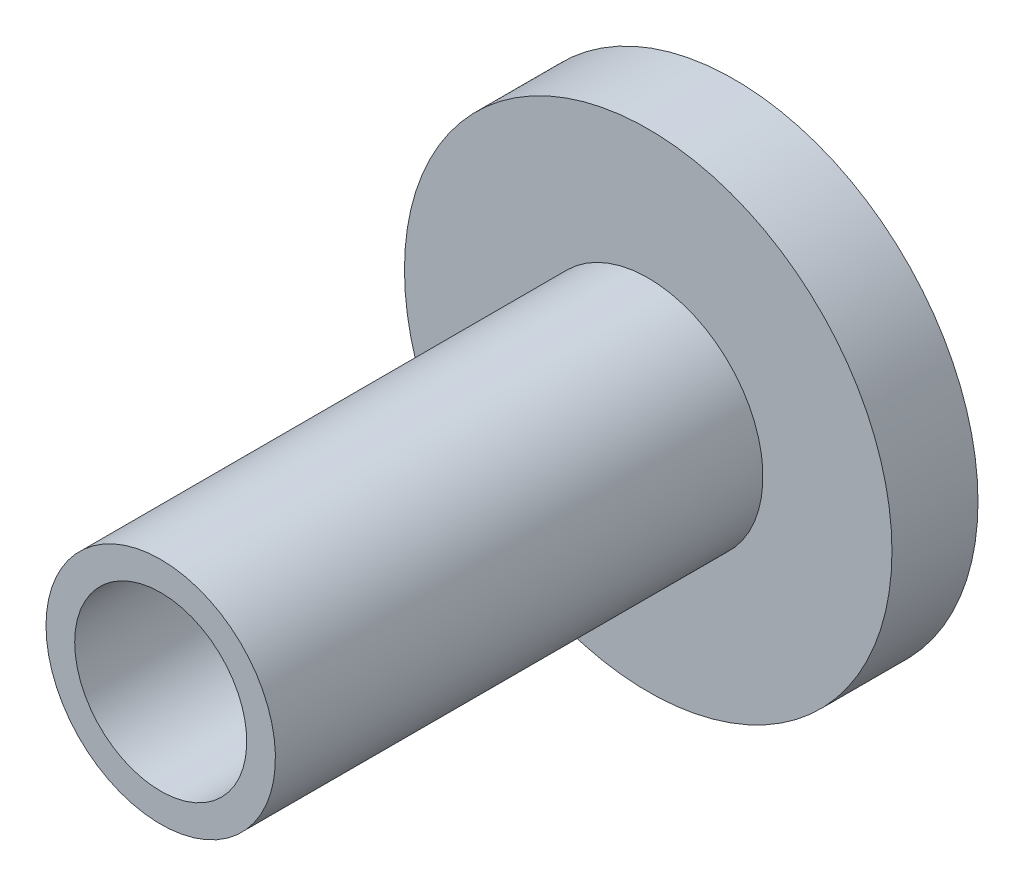
ISO-10303-21;
HEADER;
FILE_DESCRIPTION(('STEP AP214'),'2;1');
FILE_NAME('part.step','',(''),(''),'','','');
FILE_SCHEMA(('AUTOMOTIVE_DESIGN { 1 0 10303 214 1 1 1 1 }'));
ENDSEC;
DATA;
#1=APPLICATION_CONTEXT('core data for automotive mechanical design processes');
#2=APPLICATION_PROTOCOL_DEFINITION('international standard','automotive_design',2000,#1);
#3=PRODUCT_CONTEXT('',#1,'mechanical');
#4=PRODUCT('Part','Part','',(#3));
#5=PRODUCT_RELATED_PRODUCT_CATEGORY('part','',(#4));
#6=PRODUCT_DEFINITION_FORMATION('','',#4);
#7=PRODUCT_DEFINITION_CONTEXT('part definition',#1,'design');
#8=PRODUCT_DEFINITION('design','',#6,#7);
#9=PRODUCT_DEFINITION_SHAPE('','',#8);
#10=(LENGTH_UNIT() NAMED_UNIT(*) SI_UNIT(.MILLI.,.METRE.));
#11=(NAMED_UNIT(*) PLANE_ANGLE_UNIT() SI_UNIT($,.RADIAN.));
#12=(NAMED_UNIT(*) SI_UNIT($,.STERADIAN.) SOLID_ANGLE_UNIT());
#13=UNCERTAINTY_MEASURE_WITH_UNIT(LENGTH_MEASURE(1.E-05),#10,'distance_accuracy_value','');
#14=(GEOMETRIC_REPRESENTATION_CONTEXT(3) GLOBAL_UNCERTAINTY_ASSIGNED_CONTEXT((#13)) GLOBAL_UNIT_ASSIGNED_CONTEXT((#10,
#11,#12)) REPRESENTATION_CONTEXT('',''));
#15=CARTESIAN_POINT('',(0.,0.,0.));
#16=DIRECTION('',(0.,0.,1.));
#17=DIRECTION('',(1.,0.,0.));
#18=AXIS2_PLACEMENT_3D('',#15,#16,#17);
#19=CARTESIAN_POINT('',(131.385564386284,104.456236842962,103.210489149573));
#20=DIRECTION('',(0.,0.,-1.));
#21=DIRECTION('',(-1.,0.,0.));
#22=AXIS2_PLACEMENT_3D('',#19,#20,#21);
#23=PLANE('',#22);
#24=DIRECTION('',(-0.866025403784439,-0.5,0.));
#25=VECTOR('',#24,1.);
#26=CARTESIAN_POINT('',(131.385564386284,103.012861169988,103.210489149573));
#27=LINE('',#26,#25);
#28=CARTESIAN_POINT('',(132.635564386284,103.734549006475,103.210489149573));
#29=VERTEX_POINT('',#28);
#30=CARTESIAN_POINT('',(131.385564386284,103.012861169988,103.210489149573));
#31=VERTEX_POINT('',#30);
#32=EDGE_CURVE('E52',#29,#31,#27,.T.);
#33=ORIENTED_EDGE('',*,*,#32,.T.);
#34=DIRECTION('',(-0.866025403784438,0.5,0.));
#35=VECTOR('',#34,1.);
#36=CARTESIAN_POINT('',(130.135564386284,103.734549006475,103.210489149573));
#37=LINE('',#36,#35);
#38=CARTESIAN_POINT('',(130.135564386284,103.734549006475,103.210489149573));
#39=VERTEX_POINT('',#38);
#40=EDGE_CURVE('E11',#31,#39,#37,.T.);
#41=ORIENTED_EDGE('',*,*,#40,.T.);
#42=DIRECTION('',(0.,-1.,0.));
#43=VECTOR('',#42,1.);
#44=CARTESIAN_POINT('',(130.135564386284,105.17792467945,103.210489149573));
#45=LINE('',#44,#43);
#46=CARTESIAN_POINT('',(130.135564386284,105.17792467945,103.210489149573));
#47=VERTEX_POINT('',#46);
#48=EDGE_CURVE('E149',#47,#39,#45,.T.);
#49=ORIENTED_EDGE('',*,*,#48,.F.);
#50=DIRECTION('',(0.866025403784439,0.5,0.));
#51=VECTOR('',#50,1.);
#52=CARTESIAN_POINT('',(131.385564386284,105.899612515937,103.210489149573));
#53=LINE('',#52,#51);
#54=CARTESIAN_POINT('',(131.385564386284,105.899612515937,103.210489149573));
#55=VERTEX_POINT('',#54);
#56=EDGE_CURVE('E136',#47,#55,#53,.T.);
#57=ORIENTED_EDGE('',*,*,#56,.T.);
#58=DIRECTION('',(-0.866025403784439,0.5,0.));
#59=VECTOR('',#58,1.);
#60=CARTESIAN_POINT('',(132.635564386284,105.17792467945,103.210489149573));
#61=LINE('',#60,#59);
#62=CARTESIAN_POINT('',(132.635564386284,105.177924679449,103.210489149573));
#63=VERTEX_POINT('',#62);
#64=EDGE_CURVE('E201',#63,#55,#61,.T.);
#65=ORIENTED_EDGE('',*,*,#64,.F.);
#66=DIRECTION('',(0.,-1.,0.));
#67=VECTOR('',#66,1.);
#68=CARTESIAN_POINT('',(132.635564386284,103.734549006475,103.210489149573));
#69=LINE('',#68,#67);
#70=EDGE_CURVE('E169',#63,#29,#69,.T.);
#71=ORIENTED_EDGE('',*,*,#70,.T.);
#72=EDGE_LOOP('',(#33,#41,#49,#57,#65,#71));
#73=FACE_BOUND('',#72,.T.);
#74=ADVANCED_FACE('F42',(#73),#23,.T.);
#75=CARTESIAN_POINT('',(130.135564386284,103.734549006475,117.410489149573));
#76=DIRECTION('',(0.5,0.866025403784438,0.));
#77=DIRECTION('',(0.,0.,-1.));
#78=AXIS2_PLACEMENT_3D('',#75,#76,#77);
#79=PLANE('',#78);
#80=DIRECTION('',(0.,0.,1.));
#81=VECTOR('',#80,1.);
#82=CARTESIAN_POINT('',(130.135564386284,103.734549006475,117.410489149573));
#83=LINE('',#82,#81);
#84=CARTESIAN_POINT('',(130.135564386284,103.734549006475,102.210489149573));
#85=VERTEX_POINT('',#84);
#86=EDGE_CURVE('E152',#85,#39,#83,.T.);
#87=ORIENTED_EDGE('',*,*,#86,.T.);
#88=ORIENTED_EDGE('',*,*,#40,.F.);
#89=DIRECTION('',(0.,0.,1.));
#90=VECTOR('',#89,1.);
#91=CARTESIAN_POINT('',(131.385564386284,103.012861169988,117.410489149573));
#92=LINE('',#91,#90);
#93=CARTESIAN_POINT('',(131.385564386284,103.012861169988,102.210489149573));
#94=VERTEX_POINT('',#93);
#95=EDGE_CURVE('E179',#94,#31,#92,.T.);
#96=ORIENTED_EDGE('',*,*,#95,.F.);
#97=DIRECTION('',(0.866025403784438,-0.5,0.));
#98=VECTOR('',#97,1.);
#99=CARTESIAN_POINT('',(130.760564386284,103.373705088232,102.210489149573));
#100=LINE('',#99,#98);
#101=EDGE_CURVE('E216',#85,#94,#100,.T.);
#102=ORIENTED_EDGE('',*,*,#101,.F.);
#103=EDGE_LOOP('',(#87,#88,#96,#102));
#104=FACE_BOUND('',#103,.T.);
#105=ADVANCED_FACE('F239',(#104),#79,.T.);
#106=CARTESIAN_POINT('',(131.385564386284,103.012861169988,117.410489149573));
#107=DIRECTION('',(-0.5,0.866025403784439,0.));
#108=DIRECTION('',(0.,0.,1.));
#109=AXIS2_PLACEMENT_3D('',#106,#107,#108);
#110=PLANE('',#109);
#111=ORIENTED_EDGE('',*,*,#95,.T.);
#112=ORIENTED_EDGE('',*,*,#32,.F.);
#113=DIRECTION('',(0.,0.,1.));
#114=VECTOR('',#113,1.);
#115=CARTESIAN_POINT('',(132.635564386284,103.734549006475,117.410489149573));
#116=LINE('',#115,#114);
#117=CARTESIAN_POINT('',(132.635564386284,103.734549006475,102.210489149573));
#118=VERTEX_POINT('',#117);
#119=EDGE_CURVE('E188',#118,#29,#116,.T.);
#120=ORIENTED_EDGE('',*,*,#119,.F.);
#121=DIRECTION('',(0.866025403784439,0.5,0.));
#122=VECTOR('',#121,1.);
#123=CARTESIAN_POINT('',(132.010564386284,103.373705088232,102.210489149573));
#124=LINE('',#123,#122);
#125=EDGE_CURVE('E210',#94,#118,#124,.T.);
#126=ORIENTED_EDGE('',*,*,#125,.F.);
#127=EDGE_LOOP('',(#111,#112,#120,#126));
#128=FACE_BOUND('',#127,.T.);
#129=ADVANCED_FACE('F244',(#128),#110,.T.);
#130=CARTESIAN_POINT('',(132.635564386284,103.734549006475,117.410489149573));
#131=DIRECTION('',(-1.,0.,0.));
#132=DIRECTION('',(0.,0.,1.));
#133=AXIS2_PLACEMENT_3D('',#130,#131,#132);
#134=PLANE('',#133);
#135=ORIENTED_EDGE('',*,*,#119,.T.);
#136=ORIENTED_EDGE('',*,*,#70,.F.);
#137=DIRECTION('',(0.,0.,1.));
#138=VECTOR('',#137,1.);
#139=CARTESIAN_POINT('',(132.635564386284,105.177924679449,117.410489149573));
#140=LINE('',#139,#138);
#141=CARTESIAN_POINT('',(132.635564386284,105.177924679449,102.210489149573));
#142=VERTEX_POINT('',#141);
#143=EDGE_CURVE('E46',#142,#63,#140,.T.);
#144=ORIENTED_EDGE('',*,*,#143,.F.);
#145=DIRECTION('',(0.,1.,0.));
#146=VECTOR('',#145,1.);
#147=CARTESIAN_POINT('',(132.635564386284,104.456236842962,102.210489149573));
#148=LINE('',#147,#146);
#149=EDGE_CURVE('E204',#118,#142,#148,.T.);
#150=ORIENTED_EDGE('',*,*,#149,.F.);
#151=EDGE_LOOP('',(#135,#136,#144,#150));
#152=FACE_BOUND('',#151,.T.);
#153=ADVANCED_FACE('F252',(#152),#134,.T.);
#154=CARTESIAN_POINT('',(132.635564386284,105.177924679449,117.410489149573));
#155=DIRECTION('',(-0.5,-0.866025403784439,0.));
#156=DIRECTION('',(-0.866025403784439,0.5,0.));
#157=AXIS2_PLACEMENT_3D('',#154,#155,#156);
#158=PLANE('',#157);
#159=ORIENTED_EDGE('',*,*,#143,.T.);
#160=ORIENTED_EDGE('',*,*,#64,.T.);
#161=DIRECTION('',(0.,0.,1.));
#162=VECTOR('',#161,1.);
#163=CARTESIAN_POINT('',(131.385564386284,105.899612515937,117.410489149573));
#164=LINE('',#163,#162);
#165=CARTESIAN_POINT('',(131.385564386284,105.899612515937,102.210489149573));
#166=VERTEX_POINT('',#165);
#167=EDGE_CURVE('E143',#166,#55,#164,.T.);
#168=ORIENTED_EDGE('',*,*,#167,.F.);
#169=DIRECTION('',(-0.866025403784439,0.5,0.));
#170=VECTOR('',#169,1.);
#171=CARTESIAN_POINT('',(132.010564386284,105.538768597693,102.210489149573));
#172=LINE('',#171,#170);
#173=EDGE_CURVE('E176',#142,#166,#172,.T.);
#174=ORIENTED_EDGE('',*,*,#173,.F.);
#175=EDGE_LOOP('',(#159,#160,#168,#174));
#176=FACE_BOUND('',#175,.T.);
#177=ADVANCED_FACE('F255',(#176),#158,.T.);
#178=CARTESIAN_POINT('',(131.385564386284,105.899612515937,117.410489149573));
#179=DIRECTION('',(0.5,-0.866025403784439,0.));
#180=DIRECTION('',(0.,0.,-1.));
#181=AXIS2_PLACEMENT_3D('',#178,#179,#180);
#182=PLANE('',#181);
#183=ORIENTED_EDGE('',*,*,#167,.T.);
#184=ORIENTED_EDGE('',*,*,#56,.F.);
#185=DIRECTION('',(0.,0.,1.));
#186=VECTOR('',#185,1.);
#187=CARTESIAN_POINT('',(130.135564386284,105.17792467945,117.410489149573));
#188=LINE('',#187,#186);
#189=CARTESIAN_POINT('',(130.135564386284,105.17792467945,102.210489149573));
#190=VERTEX_POINT('',#189);
#191=EDGE_CURVE('E141',#190,#47,#188,.T.);
#192=ORIENTED_EDGE('',*,*,#191,.F.);
#193=DIRECTION('',(-0.866025403784439,-0.5,0.));
#194=VECTOR('',#193,1.);
#195=CARTESIAN_POINT('',(130.760564386284,105.538768597693,102.210489149573));
#196=LINE('',#195,#194);
#197=EDGE_CURVE('E194',#166,#190,#196,.T.);
#198=ORIENTED_EDGE('',*,*,#197,.F.);
#199=EDGE_LOOP('',(#183,#184,#192,#198));
#200=FACE_BOUND('',#199,.T.);
#201=ADVANCED_FACE('F138',(#200),#182,.T.);
#202=CARTESIAN_POINT('',(130.135564386284,105.17792467945,117.410489149573));
#203=DIRECTION('',(1.,0.,0.));
#204=DIRECTION('',(0.,1.,0.));
#205=AXIS2_PLACEMENT_3D('',#202,#203,#204);
#206=PLANE('',#205);
#207=ORIENTED_EDGE('',*,*,#191,.T.);
#208=ORIENTED_EDGE('',*,*,#48,.T.);
#209=ORIENTED_EDGE('',*,*,#86,.F.);
#210=DIRECTION('',(0.,-1.,0.));
#211=VECTOR('',#210,1.);
#212=CARTESIAN_POINT('',(130.135564386284,104.456236842962,102.210489149573));
#213=LINE('',#212,#211);
#214=EDGE_CURVE('E156',#190,#85,#213,.T.);
#215=ORIENTED_EDGE('',*,*,#214,.F.);
#216=EDGE_LOOP('',(#207,#208,#209,#215));
#217=FACE_BOUND('',#216,.T.);
#218=ADVANCED_FACE('F154',(#217),#206,.T.);
#219=CARTESIAN_POINT('',(131.385564386284,104.456236842962,103.710489149573));
#220=DIRECTION('',(0.,0.,-1.));
#221=DIRECTION('',(-1.,0.,0.));
#222=AXIS2_PLACEMENT_3D('',#219,#220,#221);
#223=PLANE('',#222);
#224=CARTESIAN_POINT('',(131.385564386284,104.456236842962,103.710489149573));
#225=DIRECTION('',(0.,0.,-1.));
#226=DIRECTION('',(-1.,0.,0.));
#227=AXIS2_PLACEMENT_3D('',#224,#225,#226);
#228=CIRCLE('',#227,4.25);
#229=CARTESIAN_POINT('',(127.135564386284,104.456236842962,103.710489149573));
#230=VERTEX_POINT('',#229);
#231=EDGE_CURVE('E159',#230,#230,#228,.T.);
#232=ORIENTED_EDGE('',*,*,#231,.F.);
#233=EDGE_LOOP('',(#232));
#234=FACE_BOUND('',#233,.T.);
#235=CARTESIAN_POINT('',(131.385564386284,104.456236842962,103.710489149573));
#236=DIRECTION('',(0.,0.,1.));
#237=DIRECTION('',(-1.,0.,0.));
#238=AXIS2_PLACEMENT_3D('',#235,#236,#237);
#239=CIRCLE('',#238,2.);
#240=CARTESIAN_POINT('',(129.385564386284,104.456236842962,103.710489149573));
#241=VERTEX_POINT('',#240);
#242=EDGE_CURVE('E175',#241,#241,#239,.T.);
#243=ORIENTED_EDGE('',*,*,#242,.F.);
#244=EDGE_LOOP('',(#243));
#245=FACE_BOUND('',#244,.T.);
#246=ADVANCED_FACE('F44',(#234,#245),#223,.F.);
#247=CARTESIAN_POINT('',(131.385564386284,104.456236842962,103.710489149573));
#248=DIRECTION('',(0.,0.,-1.));
#249=DIRECTION('',(-1.,0.,0.));
#250=AXIS2_PLACEMENT_3D('',#247,#248,#249);
#251=CYLINDRICAL_SURFACE('',#250,4.25);
#252=CARTESIAN_POINT('',(131.385564386284,104.456236842962,102.210489149573));
#253=DIRECTION('',(0.,0.,-1.));
#254=DIRECTION('',(-1.,0.,0.));
#255=AXIS2_PLACEMENT_3D('',#252,#253,#254);
#256=CIRCLE('',#255,4.25);
#257=CARTESIAN_POINT('',(127.135564386284,104.456236842962,102.210489149573));
#258=VERTEX_POINT('',#257);
#259=EDGE_CURVE('E191',#258,#258,#256,.T.);
#260=ORIENTED_EDGE('',*,*,#259,.F.);
#261=EDGE_LOOP('',(#260));
#262=FACE_BOUND('',#261,.T.);
#263=ORIENTED_EDGE('',*,*,#231,.T.);
#264=EDGE_LOOP('',(#263));
#265=FACE_BOUND('',#264,.T.);
#266=ADVANCED_FACE('F227',(#262,#265),#251,.T.);
#267=CARTESIAN_POINT('',(131.385564386284,104.456236842962,104.210489149573));
#268=DIRECTION('',(0.,0.,-1.));
#269=DIRECTION('',(-1.,0.,0.));
#270=AXIS2_PLACEMENT_3D('',#267,#268,#269);
#271=PLANE('',#270);
#272=CARTESIAN_POINT('',(131.385564386284,104.456236842962,104.210489149573));
#273=DIRECTION('',(0.,0.,1.));
#274=DIRECTION('',(0.,1.,0.));
#275=AXIS2_PLACEMENT_3D('',#272,#273,#274);
#276=CIRCLE('',#275,1.5);
#277=CARTESIAN_POINT('',(131.385564386284,105.956236842962,104.210489149573));
#278=VERTEX_POINT('',#277);
#279=EDGE_CURVE('E165',#278,#278,#276,.T.);
#280=ORIENTED_EDGE('',*,*,#279,.T.);
#281=EDGE_LOOP('',(#280));
#282=FACE_BOUND('',#281,.T.);
#283=ADVANCED_FACE('F233',(#282),#271,.F.);
#284=CARTESIAN_POINT('',(131.385564386284,104.456236842962,104.210489149573));
#285=DIRECTION('',(0.,0.,1.));
#286=DIRECTION('',(1.,0.,0.));
#287=AXIS2_PLACEMENT_3D('',#284,#285,#286);
#288=CYLINDRICAL_SURFACE('',#287,1.5);
#289=CARTESIAN_POINT('',(131.385564386284,104.456236842962,112.210489149573));
#290=DIRECTION('',(0.,0.,1.));
#291=DIRECTION('',(-1.,0.,0.));
#292=AXIS2_PLACEMENT_3D('',#289,#290,#291);
#293=CIRCLE('',#292,1.5);
#294=CARTESIAN_POINT('',(129.885564386284,104.456236842962,112.210489149573));
#295=VERTEX_POINT('',#294);
#296=EDGE_CURVE('E192',#295,#295,#293,.T.);
#297=ORIENTED_EDGE('',*,*,#296,.T.);
#298=EDGE_LOOP('',(#297));
#299=FACE_BOUND('',#298,.T.);
#300=ORIENTED_EDGE('',*,*,#279,.F.);
#301=EDGE_LOOP('',(#300));
#302=FACE_BOUND('',#301,.T.);
#303=ADVANCED_FACE('F249',(#299,#302),#288,.F.);
#304=CARTESIAN_POINT('',(131.385564386284,104.456236842962,112.210489149573));
#305=DIRECTION('',(0.,0.,-1.));
#306=DIRECTION('',(-1.,0.,0.));
#307=AXIS2_PLACEMENT_3D('',#304,#305,#306);
#308=PLANE('',#307);
#309=CARTESIAN_POINT('',(131.385564386284,104.456236842962,112.210489149573));
#310=DIRECTION('',(0.,0.,-1.));
#311=DIRECTION('',(0.,1.,0.));
#312=AXIS2_PLACEMENT_3D('',#309,#310,#311);
#313=CIRCLE('',#312,2.);
#314=CARTESIAN_POINT('',(131.385564386284,106.456236842962,112.210489149573));
#315=VERTEX_POINT('',#314);
#316=EDGE_CURVE('E172',#315,#315,#313,.T.);
#317=ORIENTED_EDGE('',*,*,#316,.F.);
#318=EDGE_LOOP('',(#317));
#319=FACE_BOUND('',#318,.T.);
#320=ORIENTED_EDGE('',*,*,#296,.F.);
#321=EDGE_LOOP('',(#320));
#322=FACE_BOUND('',#321,.T.);
#323=ADVANCED_FACE('F247',(#319,#322),#308,.F.);
#324=CARTESIAN_POINT('',(131.385564386284,104.456236842962,112.210489149573));
#325=DIRECTION('',(0.,0.,-1.));
#326=DIRECTION('',(-1.,0.,0.));
#327=AXIS2_PLACEMENT_3D('',#324,#325,#326);
#328=CYLINDRICAL_SURFACE('',#327,2.);
#329=ORIENTED_EDGE('',*,*,#242,.T.);
#330=EDGE_LOOP('',(#329));
#331=FACE_BOUND('',#330,.T.);
#332=ORIENTED_EDGE('',*,*,#316,.T.);
#333=EDGE_LOOP('',(#332));
#334=FACE_BOUND('',#333,.T.);
#335=ADVANCED_FACE('F223',(#331,#334),#328,.T.);
#336=CARTESIAN_POINT('',(131.385564386284,104.456236842962,102.210489149573));
#337=DIRECTION('',(0.,0.,-1.));
#338=DIRECTION('',(-1.,0.,0.));
#339=AXIS2_PLACEMENT_3D('',#336,#337,#338);
#340=PLANE('',#339);
#341=ORIENTED_EDGE('',*,*,#197,.T.);
#342=ORIENTED_EDGE('',*,*,#214,.T.);
#343=ORIENTED_EDGE('',*,*,#101,.T.);
#344=ORIENTED_EDGE('',*,*,#125,.T.);
#345=ORIENTED_EDGE('',*,*,#149,.T.);
#346=ORIENTED_EDGE('',*,*,#173,.T.);
#347=EDGE_LOOP('',(#341,#342,#343,#344,#345,#346));
#348=FACE_BOUND('',#347,.T.);
#349=ORIENTED_EDGE('',*,*,#259,.T.);
#350=EDGE_LOOP('',(#349));
#351=FACE_BOUND('',#350,.T.);
#352=ADVANCED_FACE('F257',(#348,#351),#340,.T.);
#353=CLOSED_SHELL('',(#74,#105,#129,#153,#177,#201,#218,#246,#266,#283,#303,#323,#335,#352));
#354=MANIFOLD_SOLID_BREP('B2',#353);
#355=ADVANCED_BREP_SHAPE_REPRESENTATION('',(#18,#354),#14);
#356=SHAPE_DEFINITION_REPRESENTATION(#9,#355);
ENDSEC;
END-ISO-10303-21;
